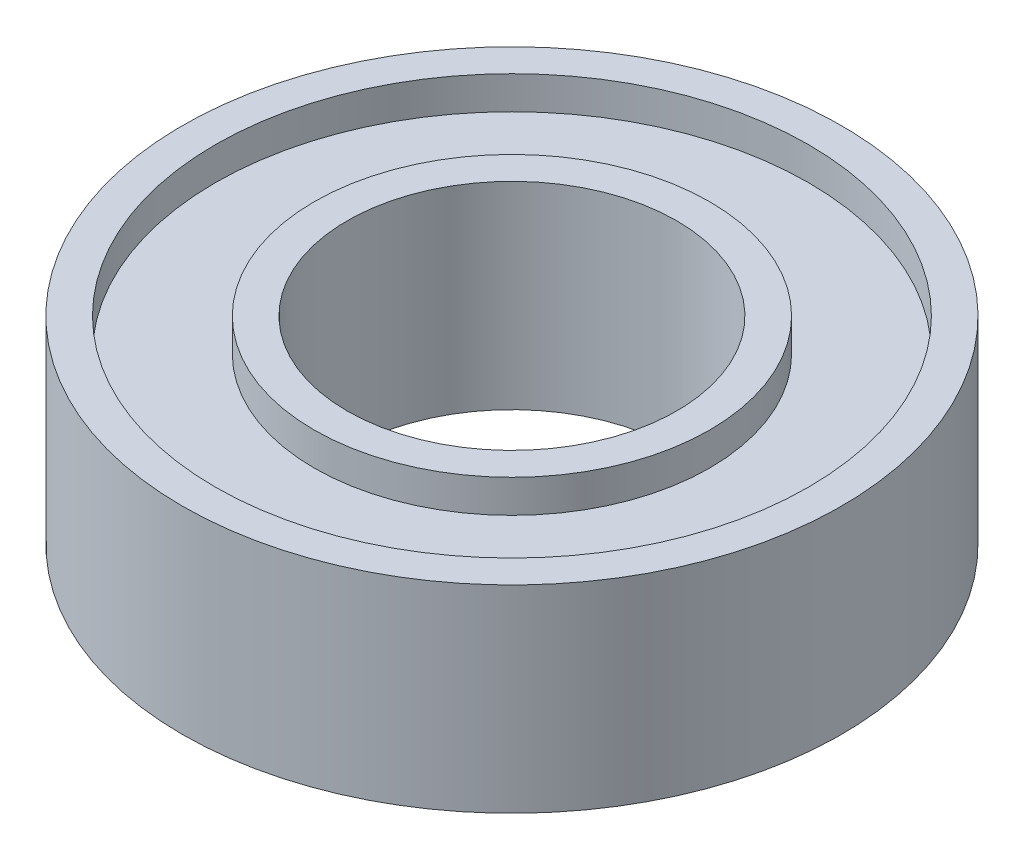
ISO-10303-21;
HEADER;
FILE_DESCRIPTION(('STEP AP214'),'2;1');
FILE_NAME('part.step','',(''),(''),'','','');
FILE_SCHEMA(('AUTOMOTIVE_DESIGN { 1 0 10303 214 1 1 1 1 }'));
ENDSEC;
DATA;
#1=APPLICATION_CONTEXT('core data for automotive mechanical design processes');
#2=APPLICATION_PROTOCOL_DEFINITION('international standard','automotive_design',2000,#1);
#3=PRODUCT_CONTEXT('',#1,'mechanical');
#4=PRODUCT('Part','Part','',(#3));
#5=PRODUCT_RELATED_PRODUCT_CATEGORY('part','',(#4));
#6=PRODUCT_DEFINITION_FORMATION('','',#4);
#7=PRODUCT_DEFINITION_CONTEXT('part definition',#1,'design');
#8=PRODUCT_DEFINITION('design','',#6,#7);
#9=PRODUCT_DEFINITION_SHAPE('','',#8);
#10=(LENGTH_UNIT() NAMED_UNIT(*) SI_UNIT(.MILLI.,.METRE.));
#11=(NAMED_UNIT(*) PLANE_ANGLE_UNIT() SI_UNIT($,.RADIAN.));
#12=(NAMED_UNIT(*) SI_UNIT($,.STERADIAN.) SOLID_ANGLE_UNIT());
#13=UNCERTAINTY_MEASURE_WITH_UNIT(LENGTH_MEASURE(1.E-05),#10,'distance_accuracy_value','');
#14=(GEOMETRIC_REPRESENTATION_CONTEXT(3) GLOBAL_UNCERTAINTY_ASSIGNED_CONTEXT((#13)) GLOBAL_UNIT_ASSIGNED_CONTEXT((#10,
#11,#12)) REPRESENTATION_CONTEXT('',''));
#15=CARTESIAN_POINT('',(0.,0.,0.));
#16=DIRECTION('',(0.,0.,1.));
#17=DIRECTION('',(1.,0.,0.));
#18=AXIS2_PLACEMENT_3D('',#15,#16,#17);
#19=CARTESIAN_POINT('',(0.,6.,0.));
#20=DIRECTION('',(0.,1.,0.));
#21=DIRECTION('',(0.,0.,1.));
#22=AXIS2_PLACEMENT_3D('',#19,#20,#21);
#23=PLANE('',#22);
#24=CARTESIAN_POINT('',(0.,6.,0.));
#25=DIRECTION('',(0.,1.,0.));
#26=DIRECTION('',(0.,0.,1.));
#27=AXIS2_PLACEMENT_3D('',#24,#25,#26);
#28=CIRCLE('',#27,5.);
#29=CARTESIAN_POINT('',(0.,6.,5.));
#30=VERTEX_POINT('',#29);
#31=EDGE_CURVE('E45',#30,#30,#28,.T.);
#32=ORIENTED_EDGE('',*,*,#31,.F.);
#33=EDGE_LOOP('',(#32));
#34=FACE_BOUND('',#33,.T.);
#35=CARTESIAN_POINT('',(0.,6.,0.));
#36=DIRECTION('',(0.,1.,0.));
#37=DIRECTION('',(0.,0.,1.));
#38=AXIS2_PLACEMENT_3D('',#35,#36,#37);
#39=CIRCLE('',#38,6.);
#40=CARTESIAN_POINT('',(0.,6.,6.));
#41=VERTEX_POINT('',#40);
#42=EDGE_CURVE('E55',#41,#41,#39,.T.);
#43=ORIENTED_EDGE('',*,*,#42,.T.);
#44=EDGE_LOOP('',(#43));
#45=FACE_BOUND('',#44,.T.);
#46=ADVANCED_FACE('F31',(#34,#45),#23,.T.);
#47=CARTESIAN_POINT('',(0.,6.,0.));
#48=DIRECTION('',(0.,-1.,0.));
#49=DIRECTION('',(0.,0.,-1.));
#50=AXIS2_PLACEMENT_3D('',#47,#48,#49);
#51=CYLINDRICAL_SURFACE('',#50,10.);
#52=CARTESIAN_POINT('',(0.,6.,0.));
#53=DIRECTION('',(0.,1.,0.));
#54=DIRECTION('',(0.,0.,1.));
#55=AXIS2_PLACEMENT_3D('',#52,#53,#54);
#56=CIRCLE('',#55,10.);
#57=CARTESIAN_POINT('',(0.,6.,10.));
#58=VERTEX_POINT('',#57);
#59=EDGE_CURVE('E10',#58,#58,#56,.T.);
#60=ORIENTED_EDGE('',*,*,#59,.F.);
#61=EDGE_LOOP('',(#60));
#62=FACE_BOUND('',#61,.T.);
#63=CARTESIAN_POINT('',(0.,0.,0.));
#64=DIRECTION('',(0.,1.,0.));
#65=DIRECTION('',(0.,0.,1.));
#66=AXIS2_PLACEMENT_3D('',#63,#64,#65);
#67=CIRCLE('',#66,10.);
#68=CARTESIAN_POINT('',(0.,0.,10.));
#69=VERTEX_POINT('',#68);
#70=EDGE_CURVE('E39',#69,#69,#67,.T.);
#71=ORIENTED_EDGE('',*,*,#70,.T.);
#72=EDGE_LOOP('',(#71));
#73=FACE_BOUND('',#72,.T.);
#74=ADVANCED_FACE('F33',(#62,#73),#51,.T.);
#75=CARTESIAN_POINT('',(0.,6.,0.));
#76=DIRECTION('',(0.,1.,0.));
#77=DIRECTION('',(0.,0.,1.));
#78=AXIS2_PLACEMENT_3D('',#75,#76,#77);
#79=CIRCLE('',#78,9.);
#80=CARTESIAN_POINT('',(0.,6.,9.));
#81=VERTEX_POINT('',#80);
#82=EDGE_CURVE('E49',#81,#81,#79,.T.);
#83=ORIENTED_EDGE('',*,*,#82,.F.);
#84=EDGE_LOOP('',(#83));
#85=FACE_BOUND('',#84,.T.);
#86=ORIENTED_EDGE('',*,*,#59,.T.);
#87=EDGE_LOOP('',(#86));
#88=FACE_BOUND('',#87,.T.);
#89=ADVANCED_FACE('F77',(#85,#88),#23,.T.);
#90=CARTESIAN_POINT('',(0.,0.,0.));
#91=DIRECTION('',(0.,1.,0.));
#92=DIRECTION('',(0.,0.,1.));
#93=AXIS2_PLACEMENT_3D('',#90,#91,#92);
#94=PLANE('',#93);
#95=CARTESIAN_POINT('',(0.,0.,0.));
#96=DIRECTION('',(0.,1.,0.));
#97=DIRECTION('',(0.,0.,1.));
#98=AXIS2_PLACEMENT_3D('',#95,#96,#97);
#99=CIRCLE('',#98,5.);
#100=CARTESIAN_POINT('',(0.,0.,5.));
#101=VERTEX_POINT('',#100);
#102=EDGE_CURVE('E35',#101,#101,#99,.T.);
#103=ORIENTED_EDGE('',*,*,#102,.T.);
#104=EDGE_LOOP('',(#103));
#105=FACE_BOUND('',#104,.T.);
#106=ORIENTED_EDGE('',*,*,#70,.F.);
#107=EDGE_LOOP('',(#106));
#108=FACE_BOUND('',#107,.T.);
#109=ADVANCED_FACE('F79',(#105,#108),#94,.F.);
#110=CARTESIAN_POINT('',(0.,-14.,0.));
#111=DIRECTION('',(0.,1.,0.));
#112=DIRECTION('',(0.,0.,1.));
#113=AXIS2_PLACEMENT_3D('',#110,#111,#112);
#114=CYLINDRICAL_SURFACE('',#113,5.);
#115=ORIENTED_EDGE('',*,*,#31,.T.);
#116=EDGE_LOOP('',(#115));
#117=FACE_BOUND('',#116,.T.);
#118=ORIENTED_EDGE('',*,*,#102,.F.);
#119=EDGE_LOOP('',(#118));
#120=FACE_BOUND('',#119,.T.);
#121=ADVANCED_FACE('F73',(#117,#120),#114,.F.);
#122=CARTESIAN_POINT('',(0.,5.,0.));
#123=DIRECTION('',(0.,1.,0.));
#124=DIRECTION('',(0.,0.,1.));
#125=AXIS2_PLACEMENT_3D('',#122,#123,#124);
#126=CYLINDRICAL_SURFACE('',#125,9.);
#127=CARTESIAN_POINT('',(0.,5.,0.));
#128=DIRECTION('',(0.,1.,0.));
#129=DIRECTION('',(0.,0.,1.));
#130=AXIS2_PLACEMENT_3D('',#127,#128,#129);
#131=CIRCLE('',#130,9.);
#132=CARTESIAN_POINT('',(0.,5.,9.));
#133=VERTEX_POINT('',#132);
#134=EDGE_CURVE('E48',#133,#133,#131,.T.);
#135=ORIENTED_EDGE('',*,*,#134,.F.);
#136=EDGE_LOOP('',(#135));
#137=FACE_BOUND('',#136,.T.);
#138=ORIENTED_EDGE('',*,*,#82,.T.);
#139=EDGE_LOOP('',(#138));
#140=FACE_BOUND('',#139,.T.);
#141=ADVANCED_FACE('F67',(#137,#140),#126,.F.);
#142=CARTESIAN_POINT('',(0.,5.,0.));
#143=DIRECTION('',(0.,1.,0.));
#144=DIRECTION('',(0.,0.,1.));
#145=AXIS2_PLACEMENT_3D('',#142,#143,#144);
#146=PLANE('',#145);
#147=CARTESIAN_POINT('',(0.,5.,0.));
#148=DIRECTION('',(0.,1.,0.));
#149=DIRECTION('',(0.,0.,1.));
#150=AXIS2_PLACEMENT_3D('',#147,#148,#149);
#151=CIRCLE('',#150,6.);
#152=CARTESIAN_POINT('',(0.,5.,6.));
#153=VERTEX_POINT('',#152);
#154=EDGE_CURVE('E52',#153,#153,#151,.T.);
#155=ORIENTED_EDGE('',*,*,#154,.F.);
#156=EDGE_LOOP('',(#155));
#157=FACE_BOUND('',#156,.T.);
#158=ORIENTED_EDGE('',*,*,#134,.T.);
#159=EDGE_LOOP('',(#158));
#160=FACE_BOUND('',#159,.T.);
#161=ADVANCED_FACE('F64',(#157,#160),#146,.T.);
#162=CARTESIAN_POINT('',(0.,5.,0.));
#163=DIRECTION('',(0.,1.,0.));
#164=DIRECTION('',(0.,0.,1.));
#165=AXIS2_PLACEMENT_3D('',#162,#163,#164);
#166=CYLINDRICAL_SURFACE('',#165,6.);
#167=ORIENTED_EDGE('',*,*,#154,.T.);
#168=EDGE_LOOP('',(#167));
#169=FACE_BOUND('',#168,.T.);
#170=ORIENTED_EDGE('',*,*,#42,.F.);
#171=EDGE_LOOP('',(#170));
#172=FACE_BOUND('',#171,.T.);
#173=ADVANCED_FACE('F61',(#169,#172),#166,.T.);
#174=CLOSED_SHELL('',(#46,#74,#89,#109,#121,#141,#161,#173));
#175=MANIFOLD_SOLID_BREP('B2',#174);
#176=ADVANCED_BREP_SHAPE_REPRESENTATION('',(#18,#175),#14);
#177=SHAPE_DEFINITION_REPRESENTATION(#9,#176);
ENDSEC;
END-ISO-10303-21;
